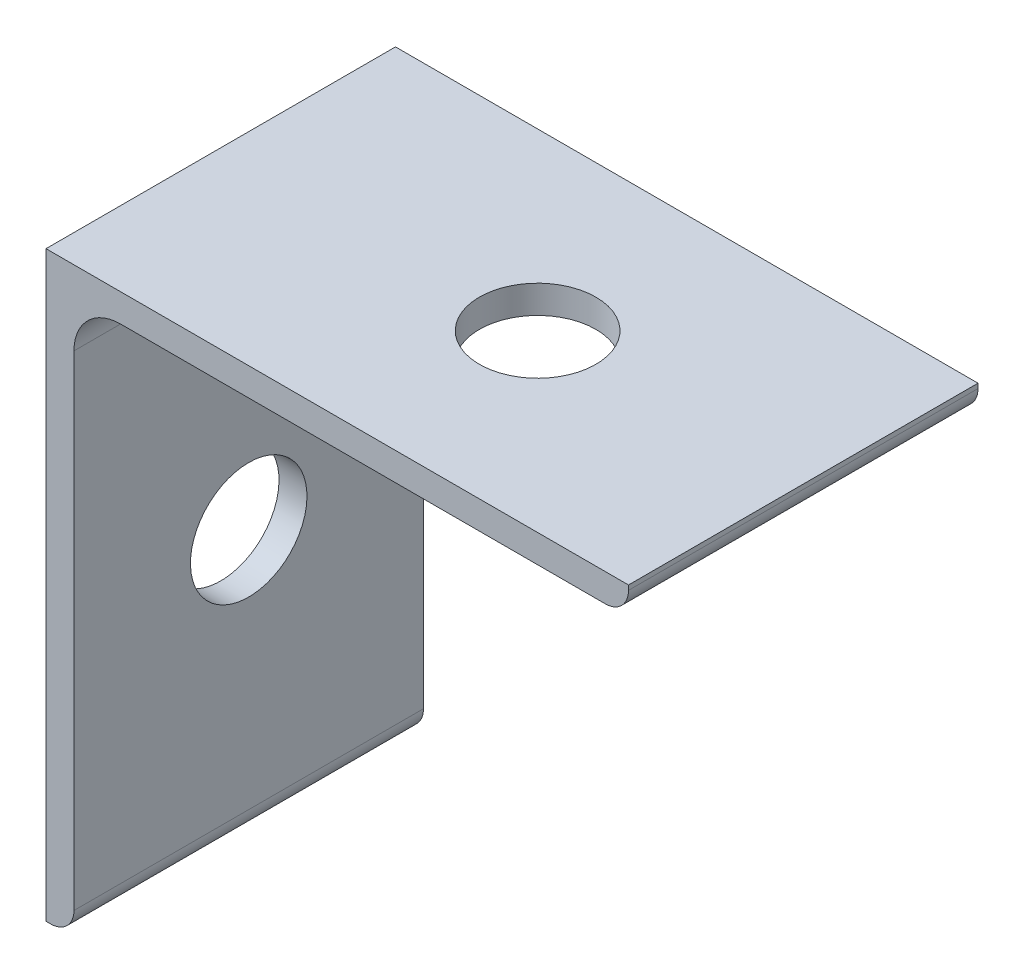
ISO-10303-21;
HEADER;
FILE_DESCRIPTION(('STEP AP214'),'2;1');
FILE_NAME('part.step','',(''),(''),'','','');
FILE_SCHEMA(('AUTOMOTIVE_DESIGN { 1 0 10303 214 1 1 1 1 }'));
ENDSEC;
DATA;
#1=APPLICATION_CONTEXT('core data for automotive mechanical design processes');
#2=APPLICATION_PROTOCOL_DEFINITION('international standard','automotive_design',2000,#1);
#3=PRODUCT_CONTEXT('',#1,'mechanical');
#4=PRODUCT('Part','Part','',(#3));
#5=PRODUCT_RELATED_PRODUCT_CATEGORY('part','',(#4));
#6=PRODUCT_DEFINITION_FORMATION('','',#4);
#7=PRODUCT_DEFINITION_CONTEXT('part definition',#1,'design');
#8=PRODUCT_DEFINITION('design','',#6,#7);
#9=PRODUCT_DEFINITION_SHAPE('','',#8);
#10=(LENGTH_UNIT() NAMED_UNIT(*) SI_UNIT(.MILLI.,.METRE.));
#11=(NAMED_UNIT(*) PLANE_ANGLE_UNIT() SI_UNIT($,.RADIAN.));
#12=(NAMED_UNIT(*) SI_UNIT($,.STERADIAN.) SOLID_ANGLE_UNIT());
#13=UNCERTAINTY_MEASURE_WITH_UNIT(LENGTH_MEASURE(1.E-05),#10,'distance_accuracy_value','');
#14=(GEOMETRIC_REPRESENTATION_CONTEXT(3) GLOBAL_UNCERTAINTY_ASSIGNED_CONTEXT((#13)) GLOBAL_UNIT_ASSIGNED_CONTEXT((#10,
#11,#12)) REPRESENTATION_CONTEXT('',''));
#15=CARTESIAN_POINT('',(0.,0.,0.));
#16=DIRECTION('',(0.,0.,1.));
#17=DIRECTION('',(1.,0.,0.));
#18=AXIS2_PLACEMENT_3D('',#15,#16,#17);
#19=CARTESIAN_POINT('',(97.5832767643443,20.430798324406,15.));
#20=DIRECTION('',(1.,0.,0.));
#21=DIRECTION('',(0.,0.,-1.));
#22=AXIS2_PLACEMENT_3D('',#19,#20,#21);
#23=PLANE('',#22);
#24=CARTESIAN_POINT('',(97.5832767643443,6.83079832440597,7.5));
#25=DIRECTION('',(1.,0.,0.));
#26=DIRECTION('',(0.,1.,0.));
#27=AXIS2_PLACEMENT_3D('',#24,#25,#26);
#28=CIRCLE('',#27,2.5);
#29=CARTESIAN_POINT('',(97.5832767643443,9.33079832440596,7.5));
#30=VERTEX_POINT('',#29);
#31=EDGE_CURVE('E209',#30,#30,#28,.T.);
#32=ORIENTED_EDGE('',*,*,#31,.T.);
#33=EDGE_LOOP('',(#32));
#34=FACE_BOUND('',#33,.T.);
#35=DIRECTION('',(0.,-1.,0.));
#36=VECTOR('',#35,1.);
#37=CARTESIAN_POINT('',(97.5832767643443,20.430798324406,0.));
#38=LINE('',#37,#36);
#39=CARTESIAN_POINT('',(97.5832767643443,20.430798324406,0.));
#40=VERTEX_POINT('',#39);
#41=CARTESIAN_POINT('',(97.5832767643443,-4.56920167559403,0.));
#42=VERTEX_POINT('',#41);
#43=EDGE_CURVE('E148',#40,#42,#38,.T.);
#44=ORIENTED_EDGE('',*,*,#43,.T.);
#45=DIRECTION('',(0.,0.,-1.));
#46=VECTOR('',#45,1.);
#47=CARTESIAN_POINT('',(97.5832767643443,-4.56920167559403,15.));
#48=LINE('',#47,#46);
#49=CARTESIAN_POINT('',(97.5832767643443,-4.56920167559403,15.));
#50=VERTEX_POINT('',#49);
#51=EDGE_CURVE('E13',#50,#42,#48,.T.);
#52=ORIENTED_EDGE('',*,*,#51,.F.);
#53=DIRECTION('',(0.,-1.,0.));
#54=VECTOR('',#53,1.);
#55=CARTESIAN_POINT('',(97.5832767643443,20.430798324406,15.));
#56=LINE('',#55,#54);
#57=CARTESIAN_POINT('',(97.5832767643443,20.430798324406,15.));
#58=VERTEX_POINT('',#57);
#59=EDGE_CURVE('E165',#58,#50,#56,.T.);
#60=ORIENTED_EDGE('',*,*,#59,.F.);
#61=DIRECTION('',(0.,0.,-1.));
#62=VECTOR('',#61,1.);
#63=CARTESIAN_POINT('',(97.5832767643443,20.430798324406,15.));
#64=LINE('',#63,#62);
#65=EDGE_CURVE('E144',#58,#40,#64,.T.);
#66=ORIENTED_EDGE('',*,*,#65,.T.);
#67=EDGE_LOOP('',(#44,#52,#60,#66));
#68=FACE_BOUND('',#67,.T.);
#69=ADVANCED_FACE('F46',(#34,#68),#23,.F.);
#70=CARTESIAN_POINT('',(97.5832767643443,-4.56920167559403,15.));
#71=DIRECTION('',(0.,1.,0.));
#72=DIRECTION('',(0.,0.,1.));
#73=AXIS2_PLACEMENT_3D('',#70,#71,#72);
#74=PLANE('',#73);
#75=DIRECTION('',(1.,0.,0.));
#76=VECTOR('',#75,1.);
#77=CARTESIAN_POINT('',(97.5832767643443,-4.56920167559403,0.));
#78=LINE('',#77,#76);
#79=CARTESIAN_POINT('',(97.7832767643443,-4.56920167559403,0.));
#80=VERTEX_POINT('',#79);
#81=EDGE_CURVE('E151',#42,#80,#78,.T.);
#82=ORIENTED_EDGE('',*,*,#81,.T.);
#83=DIRECTION('',(0.,0.,-1.));
#84=VECTOR('',#83,1.);
#85=CARTESIAN_POINT('',(97.7832767643443,-4.56920167559403,15.));
#86=LINE('',#85,#84);
#87=CARTESIAN_POINT('',(97.7832767643443,-4.56920167559403,15.));
#88=VERTEX_POINT('',#87);
#89=EDGE_CURVE('E54',#88,#80,#86,.T.);
#90=ORIENTED_EDGE('',*,*,#89,.F.);
#91=DIRECTION('',(1.,0.,0.));
#92=VECTOR('',#91,1.);
#93=CARTESIAN_POINT('',(97.5832767643443,-4.56920167559403,15.));
#94=LINE('',#93,#92);
#95=EDGE_CURVE('E108',#50,#88,#94,.T.);
#96=ORIENTED_EDGE('',*,*,#95,.F.);
#97=ORIENTED_EDGE('',*,*,#51,.T.);
#98=EDGE_LOOP('',(#82,#90,#96,#97));
#99=FACE_BOUND('',#98,.T.);
#100=ADVANCED_FACE('F235',(#99),#74,.F.);
#101=CARTESIAN_POINT('',(97.7832767643443,-3.56920167559403,15.));
#102=DIRECTION('',(0.,0.,-1.));
#103=DIRECTION('',(-1.,0.,0.));
#104=AXIS2_PLACEMENT_3D('',#101,#102,#103);
#105=CYLINDRICAL_SURFACE('',#104,1.);
#106=CARTESIAN_POINT('',(97.7832767643443,-3.56920167559403,0.));
#107=DIRECTION('',(0.,0.,1.));
#108=DIRECTION('',(-1.,0.,0.));
#109=AXIS2_PLACEMENT_3D('',#106,#107,#108);
#110=CIRCLE('',#109,1.);
#111=CARTESIAN_POINT('',(98.7832767643443,-3.56920167559403,0.));
#112=VERTEX_POINT('',#111);
#113=EDGE_CURVE('E154',#80,#112,#110,.T.);
#114=ORIENTED_EDGE('',*,*,#113,.T.);
#115=DIRECTION('',(0.,0.,-1.));
#116=VECTOR('',#115,1.);
#117=CARTESIAN_POINT('',(98.7832767643443,-3.56920167559403,15.));
#118=LINE('',#117,#116);
#119=CARTESIAN_POINT('',(98.7832767643443,-3.56920167559403,15.));
#120=VERTEX_POINT('',#119);
#121=EDGE_CURVE('E175',#120,#112,#118,.T.);
#122=ORIENTED_EDGE('',*,*,#121,.F.);
#123=CARTESIAN_POINT('',(97.7832767643443,-3.56920167559403,15.));
#124=DIRECTION('',(0.,0.,1.));
#125=DIRECTION('',(-1.,0.,0.));
#126=AXIS2_PLACEMENT_3D('',#123,#124,#125);
#127=CIRCLE('',#126,1.);
#128=EDGE_CURVE('E183',#88,#120,#127,.T.);
#129=ORIENTED_EDGE('',*,*,#128,.F.);
#130=ORIENTED_EDGE('',*,*,#89,.T.);
#131=EDGE_LOOP('',(#114,#122,#129,#130));
#132=FACE_BOUND('',#131,.T.);
#133=ADVANCED_FACE('F181',(#132),#105,.T.);
#134=CARTESIAN_POINT('',(98.7832767643443,-3.56920167559403,15.));
#135=DIRECTION('',(-1.,0.,0.));
#136=DIRECTION('',(0.,-1.,0.));
#137=AXIS2_PLACEMENT_3D('',#134,#135,#136);
#138=PLANE('',#137);
#139=CARTESIAN_POINT('',(98.7832767643443,6.83079832440596,7.5));
#140=DIRECTION('',(1.,0.,0.));
#141=DIRECTION('',(0.,1.,0.));
#142=AXIS2_PLACEMENT_3D('',#139,#140,#141);
#143=CIRCLE('',#142,2.5);
#144=CARTESIAN_POINT('',(98.7832767643443,9.33079832440596,7.5));
#145=VERTEX_POINT('',#144);
#146=EDGE_CURVE('E212',#145,#145,#143,.T.);
#147=ORIENTED_EDGE('',*,*,#146,.F.);
#148=EDGE_LOOP('',(#147));
#149=FACE_BOUND('',#148,.T.);
#150=DIRECTION('',(0.,1.,0.));
#151=VECTOR('',#150,1.);
#152=CARTESIAN_POINT('',(98.7832767643443,-3.56920167559403,0.));
#153=LINE('',#152,#151);
#154=CARTESIAN_POINT('',(98.7832767643443,17.230798324406,0.));
#155=VERTEX_POINT('',#154);
#156=EDGE_CURVE('E156',#112,#155,#153,.T.);
#157=ORIENTED_EDGE('',*,*,#156,.T.);
#158=DIRECTION('',(0.,0.,-1.));
#159=VECTOR('',#158,1.);
#160=CARTESIAN_POINT('',(98.7832767643443,17.230798324406,15.));
#161=LINE('',#160,#159);
#162=CARTESIAN_POINT('',(98.7832767643443,17.230798324406,15.));
#163=VERTEX_POINT('',#162);
#164=EDGE_CURVE('E172',#163,#155,#161,.T.);
#165=ORIENTED_EDGE('',*,*,#164,.F.);
#166=DIRECTION('',(0.,1.,0.));
#167=VECTOR('',#166,1.);
#168=CARTESIAN_POINT('',(98.7832767643443,-3.56920167559403,15.));
#169=LINE('',#168,#167);
#170=EDGE_CURVE('E199',#120,#163,#169,.T.);
#171=ORIENTED_EDGE('',*,*,#170,.F.);
#172=ORIENTED_EDGE('',*,*,#121,.T.);
#173=EDGE_LOOP('',(#157,#165,#171,#172));
#174=FACE_BOUND('',#173,.T.);
#175=ADVANCED_FACE('F192',(#149,#174),#138,.F.);
#176=CARTESIAN_POINT('',(100.783276764344,17.230798324406,15.));
#177=DIRECTION('',(0.,0.,-1.));
#178=DIRECTION('',(-1.,0.,0.));
#179=AXIS2_PLACEMENT_3D('',#176,#177,#178);
#180=CYLINDRICAL_SURFACE('',#179,2.);
#181=CARTESIAN_POINT('',(100.783276764344,17.230798324406,0.));
#182=DIRECTION('',(0.,0.,-1.));
#183=DIRECTION('',(1.,0.,0.));
#184=AXIS2_PLACEMENT_3D('',#181,#182,#183);
#185=CIRCLE('',#184,2.);
#186=CARTESIAN_POINT('',(100.783276764344,19.230798324406,0.));
#187=VERTEX_POINT('',#186);
#188=EDGE_CURVE('E158',#155,#187,#185,.T.);
#189=ORIENTED_EDGE('',*,*,#188,.T.);
#190=DIRECTION('',(0.,0.,-1.));
#191=VECTOR('',#190,1.);
#192=CARTESIAN_POINT('',(100.783276764344,19.230798324406,15.));
#193=LINE('',#192,#191);
#194=CARTESIAN_POINT('',(100.783276764344,19.230798324406,15.));
#195=VERTEX_POINT('',#194);
#196=EDGE_CURVE('E169',#195,#187,#193,.T.);
#197=ORIENTED_EDGE('',*,*,#196,.F.);
#198=CARTESIAN_POINT('',(100.783276764344,17.230798324406,15.));
#199=DIRECTION('',(0.,0.,-1.));
#200=DIRECTION('',(1.,0.,0.));
#201=AXIS2_PLACEMENT_3D('',#198,#199,#200);
#202=CIRCLE('',#201,2.);
#203=EDGE_CURVE('E198',#163,#195,#202,.T.);
#204=ORIENTED_EDGE('',*,*,#203,.F.);
#205=ORIENTED_EDGE('',*,*,#164,.T.);
#206=EDGE_LOOP('',(#189,#197,#204,#205));
#207=FACE_BOUND('',#206,.T.);
#208=ADVANCED_FACE('F196',(#207),#180,.F.);
#209=CARTESIAN_POINT('',(121.583276764344,19.230798324406,15.));
#210=DIRECTION('',(0.,1.,0.));
#211=DIRECTION('',(0.,0.,1.));
#212=AXIS2_PLACEMENT_3D('',#209,#210,#211);
#213=PLANE('',#212);
#214=CARTESIAN_POINT('',(111.183276764344,19.230798324406,7.5));
#215=DIRECTION('',(0.,-1.,0.));
#216=DIRECTION('',(0.,0.,-1.));
#217=AXIS2_PLACEMENT_3D('',#214,#215,#216);
#218=CIRCLE('',#217,2.5);
#219=CARTESIAN_POINT('',(111.183276764344,19.230798324406,5.));
#220=VERTEX_POINT('',#219);
#221=EDGE_CURVE('E206',#220,#220,#218,.T.);
#222=ORIENTED_EDGE('',*,*,#221,.F.);
#223=EDGE_LOOP('',(#222));
#224=FACE_BOUND('',#223,.T.);
#225=DIRECTION('',(1.,0.,0.));
#226=VECTOR('',#225,1.);
#227=CARTESIAN_POINT('',(121.583276764344,19.230798324406,0.));
#228=LINE('',#227,#226);
#229=CARTESIAN_POINT('',(121.583276764344,19.230798324406,0.));
#230=VERTEX_POINT('',#229);
#231=EDGE_CURVE('E160',#187,#230,#228,.T.);
#232=ORIENTED_EDGE('',*,*,#231,.T.);
#233=DIRECTION('',(0.,0.,-1.));
#234=VECTOR('',#233,1.);
#235=CARTESIAN_POINT('',(121.583276764344,19.230798324406,15.));
#236=LINE('',#235,#234);
#237=CARTESIAN_POINT('',(121.583276764344,19.230798324406,15.));
#238=VERTEX_POINT('',#237);
#239=EDGE_CURVE('E139',#238,#230,#236,.T.);
#240=ORIENTED_EDGE('',*,*,#239,.F.);
#241=DIRECTION('',(1.,0.,0.));
#242=VECTOR('',#241,1.);
#243=CARTESIAN_POINT('',(121.583276764344,19.230798324406,15.));
#244=LINE('',#243,#242);
#245=EDGE_CURVE('E130',#195,#238,#244,.T.);
#246=ORIENTED_EDGE('',*,*,#245,.F.);
#247=ORIENTED_EDGE('',*,*,#196,.T.);
#248=EDGE_LOOP('',(#232,#240,#246,#247));
#249=FACE_BOUND('',#248,.T.);
#250=ADVANCED_FACE('F233',(#224,#249),#213,.F.);
#251=CARTESIAN_POINT('',(121.583276764344,20.230798324406,15.));
#252=DIRECTION('',(0.,0.,-1.));
#253=DIRECTION('',(-1.,0.,0.));
#254=AXIS2_PLACEMENT_3D('',#251,#252,#253);
#255=CYLINDRICAL_SURFACE('',#254,1.);
#256=CARTESIAN_POINT('',(121.583276764344,20.230798324406,0.));
#257=DIRECTION('',(0.,0.,1.));
#258=DIRECTION('',(1.,0.,0.));
#259=AXIS2_PLACEMENT_3D('',#256,#257,#258);
#260=CIRCLE('',#259,1.);
#261=CARTESIAN_POINT('',(122.583276764344,20.230798324406,0.));
#262=VERTEX_POINT('',#261);
#263=EDGE_CURVE('E138',#230,#262,#260,.T.);
#264=ORIENTED_EDGE('',*,*,#263,.T.);
#265=DIRECTION('',(0.,0.,-1.));
#266=VECTOR('',#265,1.);
#267=CARTESIAN_POINT('',(122.583276764344,20.230798324406,15.));
#268=LINE('',#267,#266);
#269=CARTESIAN_POINT('',(122.583276764344,20.230798324406,15.));
#270=VERTEX_POINT('',#269);
#271=EDGE_CURVE('E135',#270,#262,#268,.T.);
#272=ORIENTED_EDGE('',*,*,#271,.F.);
#273=CARTESIAN_POINT('',(121.583276764344,20.230798324406,15.));
#274=DIRECTION('',(0.,0.,1.));
#275=DIRECTION('',(1.,0.,0.));
#276=AXIS2_PLACEMENT_3D('',#273,#274,#275);
#277=CIRCLE('',#276,1.);
#278=EDGE_CURVE('E124',#238,#270,#277,.T.);
#279=ORIENTED_EDGE('',*,*,#278,.F.);
#280=ORIENTED_EDGE('',*,*,#239,.T.);
#281=EDGE_LOOP('',(#264,#272,#279,#280));
#282=FACE_BOUND('',#281,.T.);
#283=ADVANCED_FACE('F136',(#282),#255,.T.);
#284=CARTESIAN_POINT('',(122.583276764344,20.430798324406,15.));
#285=DIRECTION('',(-1.,0.,0.));
#286=DIRECTION('',(0.,0.,1.));
#287=AXIS2_PLACEMENT_3D('',#284,#285,#286);
#288=PLANE('',#287);
#289=DIRECTION('',(0.,1.,0.));
#290=VECTOR('',#289,1.);
#291=CARTESIAN_POINT('',(122.583276764344,20.430798324406,0.));
#292=LINE('',#291,#290);
#293=CARTESIAN_POINT('',(122.583276764344,20.430798324406,0.));
#294=VERTEX_POINT('',#293);
#295=EDGE_CURVE('E94',#262,#294,#292,.T.);
#296=ORIENTED_EDGE('',*,*,#295,.T.);
#297=DIRECTION('',(0.,0.,-1.));
#298=VECTOR('',#297,1.);
#299=CARTESIAN_POINT('',(122.583276764344,20.430798324406,15.));
#300=LINE('',#299,#298);
#301=CARTESIAN_POINT('',(122.583276764344,20.430798324406,15.));
#302=VERTEX_POINT('',#301);
#303=EDGE_CURVE('E140',#302,#294,#300,.T.);
#304=ORIENTED_EDGE('',*,*,#303,.F.);
#305=DIRECTION('',(0.,1.,0.));
#306=VECTOR('',#305,1.);
#307=CARTESIAN_POINT('',(122.583276764344,20.430798324406,15.));
#308=LINE('',#307,#306);
#309=EDGE_CURVE('E128',#270,#302,#308,.T.);
#310=ORIENTED_EDGE('',*,*,#309,.F.);
#311=ORIENTED_EDGE('',*,*,#271,.T.);
#312=EDGE_LOOP('',(#296,#304,#310,#311));
#313=FACE_BOUND('',#312,.T.);
#314=ADVANCED_FACE('F142',(#313),#288,.F.);
#315=CARTESIAN_POINT('',(97.5832767643443,20.430798324406,15.));
#316=DIRECTION('',(0.,-1.,0.));
#317=DIRECTION('',(0.,0.,-1.));
#318=AXIS2_PLACEMENT_3D('',#315,#316,#317);
#319=PLANE('',#318);
#320=CARTESIAN_POINT('',(111.183276764344,20.430798324406,7.5));
#321=DIRECTION('',(0.,-1.,0.));
#322=DIRECTION('',(0.,0.,-1.));
#323=AXIS2_PLACEMENT_3D('',#320,#321,#322);
#324=CIRCLE('',#323,2.5);
#325=CARTESIAN_POINT('',(111.183276764344,20.430798324406,5.));
#326=VERTEX_POINT('',#325);
#327=EDGE_CURVE('E152',#326,#326,#324,.T.);
#328=ORIENTED_EDGE('',*,*,#327,.T.);
#329=EDGE_LOOP('',(#328));
#330=FACE_BOUND('',#329,.T.);
#331=DIRECTION('',(-1.,0.,0.));
#332=VECTOR('',#331,1.);
#333=CARTESIAN_POINT('',(97.5832767643443,20.430798324406,0.));
#334=LINE('',#333,#332);
#335=EDGE_CURVE('E100',#294,#40,#334,.T.);
#336=ORIENTED_EDGE('',*,*,#335,.T.);
#337=ORIENTED_EDGE('',*,*,#65,.F.);
#338=DIRECTION('',(-1.,0.,0.));
#339=VECTOR('',#338,1.);
#340=CARTESIAN_POINT('',(97.5832767643443,20.430798324406,15.));
#341=LINE('',#340,#339);
#342=EDGE_CURVE('E62',#302,#58,#341,.T.);
#343=ORIENTED_EDGE('',*,*,#342,.F.);
#344=ORIENTED_EDGE('',*,*,#303,.T.);
#345=EDGE_LOOP('',(#336,#337,#343,#344));
#346=FACE_BOUND('',#345,.T.);
#347=ADVANCED_FACE('F257',(#330,#346),#319,.F.);
#348=CARTESIAN_POINT('',(97.7832767643443,-3.56920167559403,15.));
#349=DIRECTION('',(0.,0.,-1.));
#350=DIRECTION('',(-1.,0.,0.));
#351=AXIS2_PLACEMENT_3D('',#348,#349,#350);
#352=PLANE('',#351);
#353=ORIENTED_EDGE('',*,*,#59,.T.);
#354=ORIENTED_EDGE('',*,*,#95,.T.);
#355=ORIENTED_EDGE('',*,*,#128,.T.);
#356=ORIENTED_EDGE('',*,*,#170,.T.);
#357=ORIENTED_EDGE('',*,*,#203,.T.);
#358=ORIENTED_EDGE('',*,*,#245,.T.);
#359=ORIENTED_EDGE('',*,*,#278,.T.);
#360=ORIENTED_EDGE('',*,*,#309,.T.);
#361=ORIENTED_EDGE('',*,*,#342,.T.);
#362=EDGE_LOOP('',(#353,#354,#355,#356,#357,#358,#359,#360,#361));
#363=FACE_BOUND('',#362,.T.);
#364=ADVANCED_FACE('F126',(#363),#352,.F.);
#365=CARTESIAN_POINT('',(97.7832767643443,-3.56920167559403,0.));
#366=DIRECTION('',(0.,0.,-1.));
#367=DIRECTION('',(-1.,0.,0.));
#368=AXIS2_PLACEMENT_3D('',#365,#366,#367);
#369=PLANE('',#368);
#370=ORIENTED_EDGE('',*,*,#43,.F.);
#371=ORIENTED_EDGE('',*,*,#335,.F.);
#372=ORIENTED_EDGE('',*,*,#295,.F.);
#373=ORIENTED_EDGE('',*,*,#263,.F.);
#374=ORIENTED_EDGE('',*,*,#231,.F.);
#375=ORIENTED_EDGE('',*,*,#188,.F.);
#376=ORIENTED_EDGE('',*,*,#156,.F.);
#377=ORIENTED_EDGE('',*,*,#113,.F.);
#378=ORIENTED_EDGE('',*,*,#81,.F.);
#379=EDGE_LOOP('',(#370,#371,#372,#373,#374,#375,#376,#377,#378));
#380=FACE_BOUND('',#379,.T.);
#381=ADVANCED_FACE('F187',(#380),#369,.T.);
#382=CARTESIAN_POINT('',(111.183276764344,20.430798324406,7.5));
#383=DIRECTION('',(0.,-1.,0.));
#384=DIRECTION('',(0.,0.,-1.));
#385=AXIS2_PLACEMENT_3D('',#382,#383,#384);
#386=CYLINDRICAL_SURFACE('',#385,2.5);
#387=ORIENTED_EDGE('',*,*,#327,.F.);
#388=EDGE_LOOP('',(#387));
#389=FACE_BOUND('',#388,.T.);
#390=ORIENTED_EDGE('',*,*,#221,.T.);
#391=EDGE_LOOP('',(#390));
#392=FACE_BOUND('',#391,.T.);
#393=ADVANCED_FACE('F223',(#389,#392),#386,.F.);
#394=CARTESIAN_POINT('',(97.5832767643443,6.83079832440597,7.5));
#395=DIRECTION('',(1.,0.,0.));
#396=DIRECTION('',(0.,1.,0.));
#397=AXIS2_PLACEMENT_3D('',#394,#395,#396);
#398=CYLINDRICAL_SURFACE('',#397,2.5);
#399=ORIENTED_EDGE('',*,*,#31,.F.);
#400=EDGE_LOOP('',(#399));
#401=FACE_BOUND('',#400,.T.);
#402=ORIENTED_EDGE('',*,*,#146,.T.);
#403=EDGE_LOOP('',(#402));
#404=FACE_BOUND('',#403,.T.);
#405=ADVANCED_FACE('F220',(#401,#404),#398,.F.);
#406=CLOSED_SHELL('',(#69,#100,#133,#175,#208,#250,#283,#314,#347,#364,#381,#393,#405));
#407=MANIFOLD_SOLID_BREP('B2',#406);
#408=ADVANCED_BREP_SHAPE_REPRESENTATION('',(#18,#407),#14);
#409=SHAPE_DEFINITION_REPRESENTATION(#9,#408);
ENDSEC;
END-ISO-10303-21;
